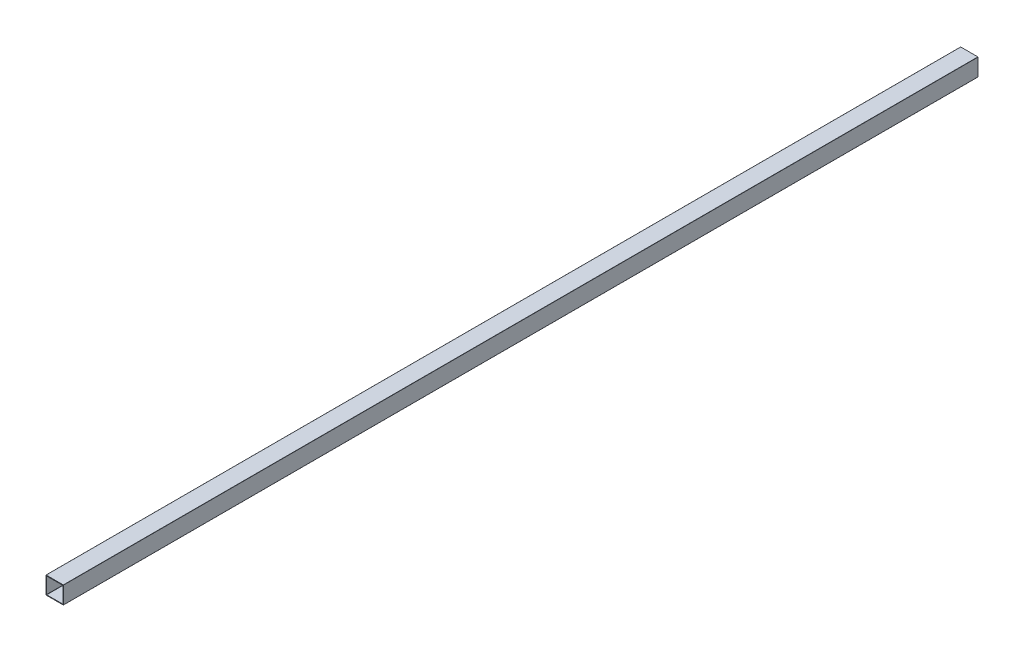
ISO-10303-21;
HEADER;
FILE_DESCRIPTION(('STEP AP214'),'2;1');
FILE_NAME('part.step','',(''),(''),'','','');
FILE_SCHEMA(('AUTOMOTIVE_DESIGN { 1 0 10303 214 1 1 1 1 }'));
ENDSEC;
DATA;
#1=APPLICATION_CONTEXT('core data for automotive mechanical design processes');
#2=APPLICATION_PROTOCOL_DEFINITION('international standard','automotive_design',2000,#1);
#3=PRODUCT_CONTEXT('',#1,'mechanical');
#4=PRODUCT('Part','Part','',(#3));
#5=PRODUCT_RELATED_PRODUCT_CATEGORY('part','',(#4));
#6=PRODUCT_DEFINITION_FORMATION('','',#4);
#7=PRODUCT_DEFINITION_CONTEXT('part definition',#1,'design');
#8=PRODUCT_DEFINITION('design','',#6,#7);
#9=PRODUCT_DEFINITION_SHAPE('','',#8);
#10=(LENGTH_UNIT() NAMED_UNIT(*) SI_UNIT(.MILLI.,.METRE.));
#11=(NAMED_UNIT(*) PLANE_ANGLE_UNIT() SI_UNIT($,.RADIAN.));
#12=(NAMED_UNIT(*) SI_UNIT($,.STERADIAN.) SOLID_ANGLE_UNIT());
#13=UNCERTAINTY_MEASURE_WITH_UNIT(LENGTH_MEASURE(1.E-05),#10,'distance_accuracy_value','');
#14=(GEOMETRIC_REPRESENTATION_CONTEXT(3) GLOBAL_UNCERTAINTY_ASSIGNED_CONTEXT((#13)) GLOBAL_UNIT_ASSIGNED_CONTEXT((#10,
#11,#12)) REPRESENTATION_CONTEXT('',''));
#15=CARTESIAN_POINT('',(0.,0.,0.));
#16=DIRECTION('',(0.,0.,1.));
#17=DIRECTION('',(1.,0.,0.));
#18=AXIS2_PLACEMENT_3D('',#15,#16,#17);
#19=CARTESIAN_POINT('',(57.15,-57.15,-6000.));
#20=DIRECTION('',(1.,0.,0.));
#21=DIRECTION('',(0.,0.,-1.));
#22=AXIS2_PLACEMENT_3D('',#19,#20,#21);
#23=PLANE('',#22);
#24=DIRECTION('',(0.,1.,0.));
#25=VECTOR('',#24,1.);
#26=CARTESIAN_POINT('',(57.15,-57.15,0.));
#27=LINE('',#26,#25);
#28=CARTESIAN_POINT('',(57.15,-56.15,0.));
#29=VERTEX_POINT('',#28);
#30=CARTESIAN_POINT('',(57.15,56.15,0.));
#31=VERTEX_POINT('',#30);
#32=EDGE_CURVE('E197',#29,#31,#27,.T.);
#33=ORIENTED_EDGE('',*,*,#32,.F.);
#34=DIRECTION('',(0.,0.,1.));
#35=VECTOR('',#34,1.);
#36=CARTESIAN_POINT('',(57.15,-56.15,-6000.));
#37=LINE('',#36,#35);
#38=CARTESIAN_POINT('',(57.15,-56.15,-6000.));
#39=VERTEX_POINT('',#38);
#40=EDGE_CURVE('E158',#29,#39,#37,.F.);
#41=ORIENTED_EDGE('',*,*,#40,.T.);
#42=DIRECTION('',(0.,1.,0.));
#43=VECTOR('',#42,1.);
#44=CARTESIAN_POINT('',(57.15,-57.15,-6000.));
#45=LINE('',#44,#43);
#46=CARTESIAN_POINT('',(57.15,56.15,-6000.));
#47=VERTEX_POINT('',#46);
#48=EDGE_CURVE('E185',#39,#47,#45,.T.);
#49=ORIENTED_EDGE('',*,*,#48,.T.);
#50=DIRECTION('',(0.,0.,1.));
#51=VECTOR('',#50,1.);
#52=CARTESIAN_POINT('',(57.15,56.15,-6000.));
#53=LINE('',#52,#51);
#54=EDGE_CURVE('E251',#47,#31,#53,.T.);
#55=ORIENTED_EDGE('',*,*,#54,.T.);
#56=EDGE_LOOP('',(#33,#41,#49,#55));
#57=FACE_BOUND('',#56,.T.);
#58=ADVANCED_FACE('F33',(#57),#23,.T.);
#59=CARTESIAN_POINT('',(-57.15,-57.15,-6000.));
#60=DIRECTION('',(0.,-1.,0.));
#61=DIRECTION('',(0.,0.,-1.));
#62=AXIS2_PLACEMENT_3D('',#59,#60,#61);
#63=PLANE('',#62);
#64=DIRECTION('',(1.,0.,0.));
#65=VECTOR('',#64,1.);
#66=CARTESIAN_POINT('',(-57.15,-57.15,0.));
#67=LINE('',#66,#65);
#68=CARTESIAN_POINT('',(-56.15,-57.15,0.));
#69=VERTEX_POINT('',#68);
#70=CARTESIAN_POINT('',(56.15,-57.15,0.));
#71=VERTEX_POINT('',#70);
#72=EDGE_CURVE('E189',#69,#71,#67,.T.);
#73=ORIENTED_EDGE('',*,*,#72,.F.);
#74=DIRECTION('',(0.,0.,1.));
#75=VECTOR('',#74,1.);
#76=CARTESIAN_POINT('',(-56.15,-57.15,-6000.));
#77=LINE('',#76,#75);
#78=CARTESIAN_POINT('',(-56.15,-57.15,-6000.));
#79=VERTEX_POINT('',#78);
#80=EDGE_CURVE('E238',#69,#79,#77,.F.);
#81=ORIENTED_EDGE('',*,*,#80,.T.);
#82=DIRECTION('',(1.,0.,0.));
#83=VECTOR('',#82,1.);
#84=CARTESIAN_POINT('',(-57.15,-57.15,-6000.));
#85=LINE('',#84,#83);
#86=CARTESIAN_POINT('',(56.15,-57.15,-6000.));
#87=VERTEX_POINT('',#86);
#88=EDGE_CURVE('E194',#79,#87,#85,.T.);
#89=ORIENTED_EDGE('',*,*,#88,.T.);
#90=DIRECTION('',(0.,0.,1.));
#91=VECTOR('',#90,1.);
#92=CARTESIAN_POINT('',(56.15,-57.15,-6000.));
#93=LINE('',#92,#91);
#94=EDGE_CURVE('E235',#87,#71,#93,.T.);
#95=ORIENTED_EDGE('',*,*,#94,.T.);
#96=EDGE_LOOP('',(#73,#81,#89,#95));
#97=FACE_BOUND('',#96,.T.);
#98=ADVANCED_FACE('F305',(#97),#63,.T.);
#99=CARTESIAN_POINT('',(-57.15,-57.15,-6000.));
#100=DIRECTION('',(-1.,0.,0.));
#101=DIRECTION('',(0.,0.,1.));
#102=AXIS2_PLACEMENT_3D('',#99,#100,#101);
#103=PLANE('',#102);
#104=DIRECTION('',(0.,-1.,0.));
#105=VECTOR('',#104,1.);
#106=CARTESIAN_POINT('',(-57.15,-57.15,-6000.));
#107=LINE('',#106,#105);
#108=CARTESIAN_POINT('',(-57.15,56.15,-6000.));
#109=VERTEX_POINT('',#108);
#110=CARTESIAN_POINT('',(-57.15,-56.15,-6000.));
#111=VERTEX_POINT('',#110);
#112=EDGE_CURVE('E191',#109,#111,#107,.T.);
#113=ORIENTED_EDGE('',*,*,#112,.T.);
#114=DIRECTION('',(0.,0.,1.));
#115=VECTOR('',#114,1.);
#116=CARTESIAN_POINT('',(-57.15,-56.15,-6000.));
#117=LINE('',#116,#115);
#118=CARTESIAN_POINT('',(-57.15,-56.15,0.));
#119=VERTEX_POINT('',#118);
#120=EDGE_CURVE('E224',#111,#119,#117,.T.);
#121=ORIENTED_EDGE('',*,*,#120,.T.);
#122=DIRECTION('',(0.,-1.,0.));
#123=VECTOR('',#122,1.);
#124=CARTESIAN_POINT('',(-57.15,-57.15,0.));
#125=LINE('',#124,#123);
#126=CARTESIAN_POINT('',(-57.15,56.15,0.));
#127=VERTEX_POINT('',#126);
#128=EDGE_CURVE('E203',#127,#119,#125,.T.);
#129=ORIENTED_EDGE('',*,*,#128,.F.);
#130=DIRECTION('',(0.,0.,1.));
#131=VECTOR('',#130,1.);
#132=CARTESIAN_POINT('',(-57.15,56.15,-6000.));
#133=LINE('',#132,#131);
#134=EDGE_CURVE('E222',#127,#109,#133,.F.);
#135=ORIENTED_EDGE('',*,*,#134,.T.);
#136=EDGE_LOOP('',(#113,#121,#129,#135));
#137=FACE_BOUND('',#136,.T.);
#138=ADVANCED_FACE('F311',(#137),#103,.T.);
#139=CARTESIAN_POINT('',(-57.15,57.15,-6000.));
#140=DIRECTION('',(0.,1.,0.));
#141=DIRECTION('',(0.,0.,1.));
#142=AXIS2_PLACEMENT_3D('',#139,#140,#141);
#143=PLANE('',#142);
#144=DIRECTION('',(-1.,0.,0.));
#145=VECTOR('',#144,1.);
#146=CARTESIAN_POINT('',(-57.15,57.15,-6000.));
#147=LINE('',#146,#145);
#148=CARTESIAN_POINT('',(56.15,57.15,-6000.));
#149=VERTEX_POINT('',#148);
#150=CARTESIAN_POINT('',(-56.15,57.15,-6000.));
#151=VERTEX_POINT('',#150);
#152=EDGE_CURVE('E188',#149,#151,#147,.T.);
#153=ORIENTED_EDGE('',*,*,#152,.T.);
#154=DIRECTION('',(0.,0.,1.));
#155=VECTOR('',#154,1.);
#156=CARTESIAN_POINT('',(-56.15,57.15,-6000.));
#157=LINE('',#156,#155);
#158=CARTESIAN_POINT('',(-56.15,57.15,0.));
#159=VERTEX_POINT('',#158);
#160=EDGE_CURVE('E248',#151,#159,#157,.T.);
#161=ORIENTED_EDGE('',*,*,#160,.T.);
#162=DIRECTION('',(-1.,0.,0.));
#163=VECTOR('',#162,1.);
#164=CARTESIAN_POINT('',(-57.15,57.15,0.));
#165=LINE('',#164,#163);
#166=CARTESIAN_POINT('',(56.15,57.15,0.));
#167=VERTEX_POINT('',#166);
#168=EDGE_CURVE('E200',#167,#159,#165,.T.);
#169=ORIENTED_EDGE('',*,*,#168,.F.);
#170=DIRECTION('',(0.,0.,1.));
#171=VECTOR('',#170,1.);
#172=CARTESIAN_POINT('',(56.15,57.15,-6000.));
#173=LINE('',#172,#171);
#174=EDGE_CURVE('E55',#167,#149,#173,.F.);
#175=ORIENTED_EDGE('',*,*,#174,.T.);
#176=EDGE_LOOP('',(#153,#161,#169,#175));
#177=FACE_BOUND('',#176,.T.);
#178=ADVANCED_FACE('F316',(#177),#143,.T.);
#179=CARTESIAN_POINT('',(0.,0.,-6000.));
#180=DIRECTION('',(0.,0.,-1.));
#181=DIRECTION('',(-1.,0.,0.));
#182=AXIS2_PLACEMENT_3D('',#179,#180,#181);
#183=PLANE('',#182);
#184=DIRECTION('',(0.,-1.,0.));
#185=VECTOR('',#184,1.);
#186=CARTESIAN_POINT('',(-53.35,-53.35,-6000.));
#187=LINE('',#186,#185);
#188=CARTESIAN_POINT('',(-53.35,52.35,-6000.));
#189=VERTEX_POINT('',#188);
#190=CARTESIAN_POINT('',(-53.35,-52.35,-6000.));
#191=VERTEX_POINT('',#190);
#192=EDGE_CURVE('E167',#189,#191,#187,.T.);
#193=ORIENTED_EDGE('',*,*,#192,.T.);
#194=CARTESIAN_POINT('',(-52.35,-52.35,-6000.));
#195=DIRECTION('',(0.,0.,-1.));
#196=DIRECTION('',(-1.,0.,0.));
#197=AXIS2_PLACEMENT_3D('',#194,#195,#196);
#198=CIRCLE('',#197,1.);
#199=CARTESIAN_POINT('',(-52.35,-53.35,-6000.));
#200=VERTEX_POINT('',#199);
#201=EDGE_CURVE('E11',#191,#200,#198,.F.);
#202=ORIENTED_EDGE('',*,*,#201,.T.);
#203=DIRECTION('',(1.,0.,0.));
#204=VECTOR('',#203,1.);
#205=CARTESIAN_POINT('',(-53.35,-53.35,-6000.));
#206=LINE('',#205,#204);
#207=CARTESIAN_POINT('',(52.35,-53.35,-6000.));
#208=VERTEX_POINT('',#207);
#209=EDGE_CURVE('E175',#200,#208,#206,.T.);
#210=ORIENTED_EDGE('',*,*,#209,.T.);
#211=CARTESIAN_POINT('',(52.35,-52.35,-6000.));
#212=DIRECTION('',(0.,0.,-1.));
#213=DIRECTION('',(-1.,0.,0.));
#214=AXIS2_PLACEMENT_3D('',#211,#212,#213);
#215=CIRCLE('',#214,1.);
#216=CARTESIAN_POINT('',(53.35,-52.35,-6000.));
#217=VERTEX_POINT('',#216);
#218=EDGE_CURVE('E262',#208,#217,#215,.F.);
#219=ORIENTED_EDGE('',*,*,#218,.T.);
#220=DIRECTION('',(0.,1.,0.));
#221=VECTOR('',#220,1.);
#222=CARTESIAN_POINT('',(53.35,-53.35,-6000.));
#223=LINE('',#222,#221);
#224=CARTESIAN_POINT('',(53.35,52.35,-6000.));
#225=VERTEX_POINT('',#224);
#226=EDGE_CURVE('E179',#217,#225,#223,.T.);
#227=ORIENTED_EDGE('',*,*,#226,.T.);
#228=CARTESIAN_POINT('',(52.35,52.35,-6000.));
#229=DIRECTION('',(0.,0.,-1.));
#230=DIRECTION('',(-1.,0.,0.));
#231=AXIS2_PLACEMENT_3D('',#228,#229,#230);
#232=CIRCLE('',#231,1.);
#233=CARTESIAN_POINT('',(52.35,53.35,-6000.));
#234=VERTEX_POINT('',#233);
#235=EDGE_CURVE('E258',#225,#234,#232,.F.);
#236=ORIENTED_EDGE('',*,*,#235,.T.);
#237=DIRECTION('',(-1.,0.,0.));
#238=VECTOR('',#237,1.);
#239=CARTESIAN_POINT('',(-53.35,53.35,-6000.));
#240=LINE('',#239,#238);
#241=CARTESIAN_POINT('',(-52.35,53.35,-6000.));
#242=VERTEX_POINT('',#241);
#243=EDGE_CURVE('E277',#234,#242,#240,.T.);
#244=ORIENTED_EDGE('',*,*,#243,.T.);
#245=CARTESIAN_POINT('',(-52.35,52.35,-6000.));
#246=DIRECTION('',(0.,0.,-1.));
#247=DIRECTION('',(-1.,0.,0.));
#248=AXIS2_PLACEMENT_3D('',#245,#246,#247);
#249=CIRCLE('',#248,1.);
#250=EDGE_CURVE('E157',#242,#189,#249,.F.);
#251=ORIENTED_EDGE('',*,*,#250,.T.);
#252=EDGE_LOOP('',(#193,#202,#210,#219,#227,#236,#244,#251));
#253=FACE_BOUND('',#252,.T.);
#254=ORIENTED_EDGE('',*,*,#88,.F.);
#255=CARTESIAN_POINT('',(-56.15,-56.15,-6000.));
#256=DIRECTION('',(0.,0.,-1.));
#257=DIRECTION('',(-1.,0.,0.));
#258=AXIS2_PLACEMENT_3D('',#255,#256,#257);
#259=CIRCLE('',#258,1.);
#260=EDGE_CURVE('E245',#79,#111,#259,.T.);
#261=ORIENTED_EDGE('',*,*,#260,.T.);
#262=ORIENTED_EDGE('',*,*,#112,.F.);
#263=CARTESIAN_POINT('',(-56.15,56.15,-6000.));
#264=DIRECTION('',(0.,0.,-1.));
#265=DIRECTION('',(-1.,0.,0.));
#266=AXIS2_PLACEMENT_3D('',#263,#264,#265);
#267=CIRCLE('',#266,1.);
#268=EDGE_CURVE('E48',#109,#151,#267,.T.);
#269=ORIENTED_EDGE('',*,*,#268,.T.);
#270=ORIENTED_EDGE('',*,*,#152,.F.);
#271=CARTESIAN_POINT('',(56.15,56.15,-6000.));
#272=DIRECTION('',(0.,0.,-1.));
#273=DIRECTION('',(-1.,0.,0.));
#274=AXIS2_PLACEMENT_3D('',#271,#272,#273);
#275=CIRCLE('',#274,1.);
#276=EDGE_CURVE('E240',#149,#47,#275,.T.);
#277=ORIENTED_EDGE('',*,*,#276,.T.);
#278=ORIENTED_EDGE('',*,*,#48,.F.);
#279=CARTESIAN_POINT('',(56.15,-56.15,-6000.));
#280=DIRECTION('',(0.,0.,-1.));
#281=DIRECTION('',(-1.,0.,0.));
#282=AXIS2_PLACEMENT_3D('',#279,#280,#281);
#283=CIRCLE('',#282,1.);
#284=EDGE_CURVE('E242',#39,#87,#283,.T.);
#285=ORIENTED_EDGE('',*,*,#284,.T.);
#286=EDGE_LOOP('',(#254,#261,#262,#269,#270,#277,#278,#285));
#287=FACE_BOUND('',#286,.T.);
#288=ADVANCED_FACE('F267',(#253,#287),#183,.T.);
#289=CARTESIAN_POINT('',(0.,0.,0.));
#290=DIRECTION('',(0.,0.,-1.));
#291=DIRECTION('',(-1.,0.,0.));
#292=AXIS2_PLACEMENT_3D('',#289,#290,#291);
#293=PLANE('',#292);
#294=DIRECTION('',(0.,1.,0.));
#295=VECTOR('',#294,1.);
#296=CARTESIAN_POINT('',(53.35,-53.35,0.));
#297=LINE('',#296,#295);
#298=CARTESIAN_POINT('',(53.35,-52.35,0.));
#299=VERTEX_POINT('',#298);
#300=CARTESIAN_POINT('',(53.35,52.35,0.));
#301=VERTEX_POINT('',#300);
#302=EDGE_CURVE('E181',#299,#301,#297,.T.);
#303=ORIENTED_EDGE('',*,*,#302,.F.);
#304=CARTESIAN_POINT('',(52.35,-52.35,0.));
#305=DIRECTION('',(0.,0.,-1.));
#306=DIRECTION('',(-1.,0.,0.));
#307=AXIS2_PLACEMENT_3D('',#304,#305,#306);
#308=CIRCLE('',#307,1.);
#309=CARTESIAN_POINT('',(52.35,-53.35,0.));
#310=VERTEX_POINT('',#309);
#311=EDGE_CURVE('E260',#299,#310,#308,.T.);
#312=ORIENTED_EDGE('',*,*,#311,.T.);
#313=DIRECTION('',(1.,0.,0.));
#314=VECTOR('',#313,1.);
#315=CARTESIAN_POINT('',(-53.35,-53.35,0.));
#316=LINE('',#315,#314);
#317=CARTESIAN_POINT('',(-52.35,-53.35,0.));
#318=VERTEX_POINT('',#317);
#319=EDGE_CURVE('E281',#318,#310,#316,.T.);
#320=ORIENTED_EDGE('',*,*,#319,.F.);
#321=CARTESIAN_POINT('',(-52.35,-52.35,0.));
#322=DIRECTION('',(0.,0.,-1.));
#323=DIRECTION('',(-1.,0.,0.));
#324=AXIS2_PLACEMENT_3D('',#321,#322,#323);
#325=CIRCLE('',#324,1.);
#326=CARTESIAN_POINT('',(-53.35,-52.35,0.));
#327=VERTEX_POINT('',#326);
#328=EDGE_CURVE('E41',#318,#327,#325,.T.);
#329=ORIENTED_EDGE('',*,*,#328,.T.);
#330=DIRECTION('',(0.,-1.,0.));
#331=VECTOR('',#330,1.);
#332=CARTESIAN_POINT('',(-53.35,-53.35,0.));
#333=LINE('',#332,#331);
#334=CARTESIAN_POINT('',(-53.35,52.35,0.));
#335=VERTEX_POINT('',#334);
#336=EDGE_CURVE('E164',#335,#327,#333,.T.);
#337=ORIENTED_EDGE('',*,*,#336,.F.);
#338=CARTESIAN_POINT('',(-52.35,52.35,0.));
#339=DIRECTION('',(0.,0.,-1.));
#340=DIRECTION('',(-1.,0.,0.));
#341=AXIS2_PLACEMENT_3D('',#338,#339,#340);
#342=CIRCLE('',#341,1.);
#343=CARTESIAN_POINT('',(-52.35,53.35,0.));
#344=VERTEX_POINT('',#343);
#345=EDGE_CURVE('E147',#335,#344,#342,.T.);
#346=ORIENTED_EDGE('',*,*,#345,.T.);
#347=DIRECTION('',(-1.,0.,0.));
#348=VECTOR('',#347,1.);
#349=CARTESIAN_POINT('',(-53.35,53.35,0.));
#350=LINE('',#349,#348);
#351=CARTESIAN_POINT('',(52.35,53.35,0.));
#352=VERTEX_POINT('',#351);
#353=EDGE_CURVE('E176',#352,#344,#350,.T.);
#354=ORIENTED_EDGE('',*,*,#353,.F.);
#355=CARTESIAN_POINT('',(52.35,52.35,0.));
#356=DIRECTION('',(0.,0.,-1.));
#357=DIRECTION('',(-1.,0.,0.));
#358=AXIS2_PLACEMENT_3D('',#355,#356,#357);
#359=CIRCLE('',#358,1.);
#360=EDGE_CURVE('E256',#352,#301,#359,.T.);
#361=ORIENTED_EDGE('',*,*,#360,.T.);
#362=EDGE_LOOP('',(#303,#312,#320,#329,#337,#346,#354,#361));
#363=FACE_BOUND('',#362,.T.);
#364=ORIENTED_EDGE('',*,*,#128,.T.);
#365=CARTESIAN_POINT('',(-56.15,-56.15,0.));
#366=DIRECTION('',(0.,0.,-1.));
#367=DIRECTION('',(-1.,0.,0.));
#368=AXIS2_PLACEMENT_3D('',#365,#366,#367);
#369=CIRCLE('',#368,1.);
#370=EDGE_CURVE('E233',#119,#69,#369,.F.);
#371=ORIENTED_EDGE('',*,*,#370,.T.);
#372=ORIENTED_EDGE('',*,*,#72,.T.);
#373=CARTESIAN_POINT('',(56.15,-56.15,0.));
#374=DIRECTION('',(0.,0.,-1.));
#375=DIRECTION('',(-1.,0.,0.));
#376=AXIS2_PLACEMENT_3D('',#373,#374,#375);
#377=CIRCLE('',#376,1.);
#378=EDGE_CURVE('E229',#71,#29,#377,.F.);
#379=ORIENTED_EDGE('',*,*,#378,.T.);
#380=ORIENTED_EDGE('',*,*,#32,.T.);
#381=CARTESIAN_POINT('',(56.15,56.15,0.));
#382=DIRECTION('',(0.,0.,-1.));
#383=DIRECTION('',(-1.,0.,0.));
#384=AXIS2_PLACEMENT_3D('',#381,#382,#383);
#385=CIRCLE('',#384,1.);
#386=EDGE_CURVE('E227',#31,#167,#385,.F.);
#387=ORIENTED_EDGE('',*,*,#386,.T.);
#388=ORIENTED_EDGE('',*,*,#168,.T.);
#389=CARTESIAN_POINT('',(-56.15,56.15,0.));
#390=DIRECTION('',(0.,0.,-1.));
#391=DIRECTION('',(-1.,0.,0.));
#392=AXIS2_PLACEMENT_3D('',#389,#390,#391);
#393=CIRCLE('',#392,1.);
#394=EDGE_CURVE('E231',#159,#127,#393,.F.);
#395=ORIENTED_EDGE('',*,*,#394,.T.);
#396=EDGE_LOOP('',(#364,#371,#372,#379,#380,#387,#388,#395));
#397=FACE_BOUND('',#396,.T.);
#398=ADVANCED_FACE('F172',(#363,#397),#293,.F.);
#399=CARTESIAN_POINT('',(-53.35,-53.35,-6000.));
#400=DIRECTION('',(0.,-1.,0.));
#401=DIRECTION('',(0.,0.,-1.));
#402=AXIS2_PLACEMENT_3D('',#399,#400,#401);
#403=PLANE('',#402);
#404=ORIENTED_EDGE('',*,*,#319,.T.);
#405=DIRECTION('',(0.,0.,1.));
#406=VECTOR('',#405,1.);
#407=CARTESIAN_POINT('',(52.35,-53.35,-6000.));
#408=LINE('',#407,#406);
#409=EDGE_CURVE('E220',#310,#208,#408,.F.);
#410=ORIENTED_EDGE('',*,*,#409,.T.);
#411=ORIENTED_EDGE('',*,*,#209,.F.);
#412=DIRECTION('',(0.,0.,1.));
#413=VECTOR('',#412,1.);
#414=CARTESIAN_POINT('',(-52.35,-53.35,0.));
#415=LINE('',#414,#413);
#416=EDGE_CURVE('E217',#200,#318,#415,.T.);
#417=ORIENTED_EDGE('',*,*,#416,.T.);
#418=EDGE_LOOP('',(#404,#410,#411,#417));
#419=FACE_BOUND('',#418,.T.);
#420=ADVANCED_FACE('F283',(#419),#403,.F.);
#421=CARTESIAN_POINT('',(-53.35,-53.35,-6000.));
#422=DIRECTION('',(-1.,0.,0.));
#423=DIRECTION('',(0.,0.,1.));
#424=AXIS2_PLACEMENT_3D('',#421,#422,#423);
#425=PLANE('',#424);
#426=ORIENTED_EDGE('',*,*,#192,.F.);
#427=DIRECTION('',(0.,0.,1.));
#428=VECTOR('',#427,1.);
#429=CARTESIAN_POINT('',(-53.35,52.35,0.));
#430=LINE('',#429,#428);
#431=EDGE_CURVE('E151',#189,#335,#430,.T.);
#432=ORIENTED_EDGE('',*,*,#431,.T.);
#433=ORIENTED_EDGE('',*,*,#336,.T.);
#434=DIRECTION('',(0.,0.,1.));
#435=VECTOR('',#434,1.);
#436=CARTESIAN_POINT('',(-53.35,-52.35,-6000.));
#437=LINE('',#436,#435);
#438=EDGE_CURVE('E169',#327,#191,#437,.F.);
#439=ORIENTED_EDGE('',*,*,#438,.T.);
#440=EDGE_LOOP('',(#426,#432,#433,#439));
#441=FACE_BOUND('',#440,.T.);
#442=ADVANCED_FACE('F163',(#441),#425,.F.);
#443=CARTESIAN_POINT('',(-53.35,53.35,-6000.));
#444=DIRECTION('',(0.,1.,0.));
#445=DIRECTION('',(0.,0.,1.));
#446=AXIS2_PLACEMENT_3D('',#443,#444,#445);
#447=PLANE('',#446);
#448=ORIENTED_EDGE('',*,*,#353,.T.);
#449=DIRECTION('',(0.,0.,1.));
#450=VECTOR('',#449,1.);
#451=CARTESIAN_POINT('',(-52.35,53.35,-6000.));
#452=LINE('',#451,#450);
#453=EDGE_CURVE('E152',#344,#242,#452,.F.);
#454=ORIENTED_EDGE('',*,*,#453,.T.);
#455=ORIENTED_EDGE('',*,*,#243,.F.);
#456=DIRECTION('',(0.,0.,1.));
#457=VECTOR('',#456,1.);
#458=CARTESIAN_POINT('',(52.35,53.35,0.));
#459=LINE('',#458,#457);
#460=EDGE_CURVE('E168',#234,#352,#459,.T.);
#461=ORIENTED_EDGE('',*,*,#460,.T.);
#462=EDGE_LOOP('',(#448,#454,#455,#461));
#463=FACE_BOUND('',#462,.T.);
#464=ADVANCED_FACE('F292',(#463),#447,.F.);
#465=CARTESIAN_POINT('',(53.35,-53.35,-6000.));
#466=DIRECTION('',(1.,0.,0.));
#467=DIRECTION('',(0.,1.,0.));
#468=AXIS2_PLACEMENT_3D('',#465,#466,#467);
#469=PLANE('',#468);
#470=ORIENTED_EDGE('',*,*,#302,.T.);
#471=DIRECTION('',(0.,0.,1.));
#472=VECTOR('',#471,1.);
#473=CARTESIAN_POINT('',(53.35,52.35,-6000.));
#474=LINE('',#473,#472);
#475=EDGE_CURVE('E215',#301,#225,#474,.F.);
#476=ORIENTED_EDGE('',*,*,#475,.T.);
#477=ORIENTED_EDGE('',*,*,#226,.F.);
#478=DIRECTION('',(0.,0.,1.));
#479=VECTOR('',#478,1.);
#480=CARTESIAN_POINT('',(53.35,-52.35,0.));
#481=LINE('',#480,#479);
#482=EDGE_CURVE('E212',#217,#299,#481,.T.);
#483=ORIENTED_EDGE('',*,*,#482,.T.);
#484=EDGE_LOOP('',(#470,#476,#477,#483));
#485=FACE_BOUND('',#484,.T.);
#486=ADVANCED_FACE('F275',(#485),#469,.F.);
#487=CARTESIAN_POINT('',(-52.35,52.35,-6000.));
#488=DIRECTION('',(0.,0.,-1.));
#489=DIRECTION('',(-1.,0.,0.));
#490=AXIS2_PLACEMENT_3D('',#487,#488,#489);
#491=CYLINDRICAL_SURFACE('',#490,1.);
#492=ORIENTED_EDGE('',*,*,#250,.F.);
#493=ORIENTED_EDGE('',*,*,#453,.F.);
#494=ORIENTED_EDGE('',*,*,#345,.F.);
#495=ORIENTED_EDGE('',*,*,#431,.F.);
#496=EDGE_LOOP('',(#492,#493,#494,#495));
#497=FACE_BOUND('',#496,.T.);
#498=ADVANCED_FACE('F150',(#497),#491,.F.);
#499=CARTESIAN_POINT('',(52.35,52.35,-6000.));
#500=DIRECTION('',(0.,0.,-1.));
#501=DIRECTION('',(-1.,0.,0.));
#502=AXIS2_PLACEMENT_3D('',#499,#500,#501);
#503=CYLINDRICAL_SURFACE('',#502,1.);
#504=ORIENTED_EDGE('',*,*,#235,.F.);
#505=ORIENTED_EDGE('',*,*,#475,.F.);
#506=ORIENTED_EDGE('',*,*,#360,.F.);
#507=ORIENTED_EDGE('',*,*,#460,.F.);
#508=EDGE_LOOP('',(#504,#505,#506,#507));
#509=FACE_BOUND('',#508,.T.);
#510=ADVANCED_FACE('F294',(#509),#503,.F.);
#511=CARTESIAN_POINT('',(52.35,-52.35,-6000.));
#512=DIRECTION('',(0.,0.,-1.));
#513=DIRECTION('',(-1.,0.,0.));
#514=AXIS2_PLACEMENT_3D('',#511,#512,#513);
#515=CYLINDRICAL_SURFACE('',#514,1.);
#516=ORIENTED_EDGE('',*,*,#218,.F.);
#517=ORIENTED_EDGE('',*,*,#409,.F.);
#518=ORIENTED_EDGE('',*,*,#311,.F.);
#519=ORIENTED_EDGE('',*,*,#482,.F.);
#520=EDGE_LOOP('',(#516,#517,#518,#519));
#521=FACE_BOUND('',#520,.T.);
#522=ADVANCED_FACE('F279',(#521),#515,.F.);
#523=CARTESIAN_POINT('',(-56.15,-56.15,-6000.));
#524=DIRECTION('',(0.,0.,1.));
#525=DIRECTION('',(1.,0.,0.));
#526=AXIS2_PLACEMENT_3D('',#523,#524,#525);
#527=CYLINDRICAL_SURFACE('',#526,1.);
#528=ORIENTED_EDGE('',*,*,#260,.F.);
#529=ORIENTED_EDGE('',*,*,#80,.F.);
#530=ORIENTED_EDGE('',*,*,#370,.F.);
#531=ORIENTED_EDGE('',*,*,#120,.F.);
#532=EDGE_LOOP('',(#528,#529,#530,#531));
#533=FACE_BOUND('',#532,.T.);
#534=ADVANCED_FACE('F301',(#533),#527,.T.);
#535=CARTESIAN_POINT('',(-56.15,56.15,-6000.));
#536=DIRECTION('',(0.,0.,1.));
#537=DIRECTION('',(1.,0.,0.));
#538=AXIS2_PLACEMENT_3D('',#535,#536,#537);
#539=CYLINDRICAL_SURFACE('',#538,1.);
#540=ORIENTED_EDGE('',*,*,#268,.F.);
#541=ORIENTED_EDGE('',*,*,#134,.F.);
#542=ORIENTED_EDGE('',*,*,#394,.F.);
#543=ORIENTED_EDGE('',*,*,#160,.F.);
#544=EDGE_LOOP('',(#540,#541,#542,#543));
#545=FACE_BOUND('',#544,.T.);
#546=ADVANCED_FACE('F368',(#545),#539,.T.);
#547=CARTESIAN_POINT('',(-52.35,-52.35,-6000.));
#548=DIRECTION('',(0.,0.,-1.));
#549=DIRECTION('',(-1.,0.,0.));
#550=AXIS2_PLACEMENT_3D('',#547,#548,#549);
#551=CYLINDRICAL_SURFACE('',#550,1.);
#552=ORIENTED_EDGE('',*,*,#201,.F.);
#553=ORIENTED_EDGE('',*,*,#438,.F.);
#554=ORIENTED_EDGE('',*,*,#328,.F.);
#555=ORIENTED_EDGE('',*,*,#416,.F.);
#556=EDGE_LOOP('',(#552,#553,#554,#555));
#557=FACE_BOUND('',#556,.T.);
#558=ADVANCED_FACE('F378',(#557),#551,.F.);
#559=CARTESIAN_POINT('',(56.15,-56.15,-6000.));
#560=DIRECTION('',(0.,0.,1.));
#561=DIRECTION('',(1.,0.,0.));
#562=AXIS2_PLACEMENT_3D('',#559,#560,#561);
#563=CYLINDRICAL_SURFACE('',#562,1.);
#564=ORIENTED_EDGE('',*,*,#284,.F.);
#565=ORIENTED_EDGE('',*,*,#40,.F.);
#566=ORIENTED_EDGE('',*,*,#378,.F.);
#567=ORIENTED_EDGE('',*,*,#94,.F.);
#568=EDGE_LOOP('',(#564,#565,#566,#567));
#569=FACE_BOUND('',#568,.T.);
#570=ADVANCED_FACE('F388',(#569),#563,.T.);
#571=CARTESIAN_POINT('',(56.15,56.15,-6000.));
#572=DIRECTION('',(0.,0.,1.));
#573=DIRECTION('',(1.,0.,0.));
#574=AXIS2_PLACEMENT_3D('',#571,#572,#573);
#575=CYLINDRICAL_SURFACE('',#574,1.);
#576=ORIENTED_EDGE('',*,*,#276,.F.);
#577=ORIENTED_EDGE('',*,*,#174,.F.);
#578=ORIENTED_EDGE('',*,*,#386,.F.);
#579=ORIENTED_EDGE('',*,*,#54,.F.);
#580=EDGE_LOOP('',(#576,#577,#578,#579));
#581=FACE_BOUND('',#580,.T.);
#582=ADVANCED_FACE('F35',(#581),#575,.T.);
#583=CLOSED_SHELL('',(#58,#98,#138,#178,#288,#398,#420,#442,#464,#486,#498,#510,#522,#534,#546,
#558,#570,#582));
#584=MANIFOLD_SOLID_BREP('B2',#583);
#585=ADVANCED_BREP_SHAPE_REPRESENTATION('',(#18,#584),#14);
#586=SHAPE_DEFINITION_REPRESENTATION(#9,#585);
ENDSEC;
END-ISO-10303-21;
